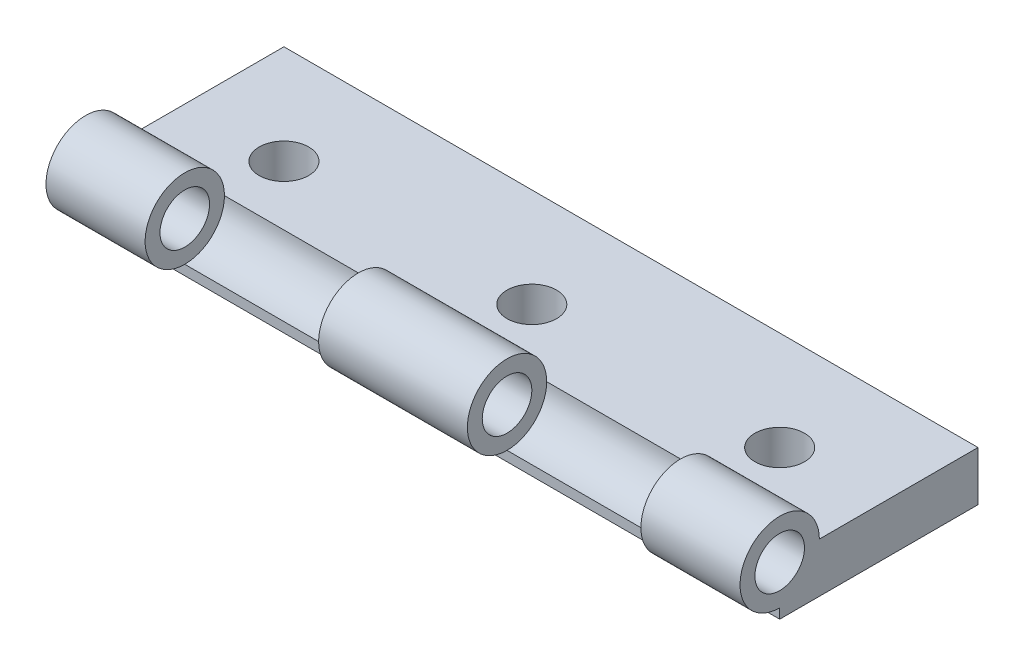
ISO-10303-21;
HEADER;
FILE_DESCRIPTION(('STEP AP214'),'2;1');
FILE_NAME('part.step','',(''),(''),'','','');
FILE_SCHEMA(('AUTOMOTIVE_DESIGN { 1 0 10303 214 1 1 1 1 }'));
ENDSEC;
DATA;
#1=APPLICATION_CONTEXT('core data for automotive mechanical design processes');
#2=APPLICATION_PROTOCOL_DEFINITION('international standard','automotive_design',2000,#1);
#3=PRODUCT_CONTEXT('',#1,'mechanical');
#4=PRODUCT('Part','Part','',(#3));
#5=PRODUCT_RELATED_PRODUCT_CATEGORY('part','',(#4));
#6=PRODUCT_DEFINITION_FORMATION('','',#4);
#7=PRODUCT_DEFINITION_CONTEXT('part definition',#1,'design');
#8=PRODUCT_DEFINITION('design','',#6,#7);
#9=PRODUCT_DEFINITION_SHAPE('','',#8);
#10=(LENGTH_UNIT() NAMED_UNIT(*) SI_UNIT(.MILLI.,.METRE.));
#11=(NAMED_UNIT(*) PLANE_ANGLE_UNIT() SI_UNIT($,.RADIAN.));
#12=(NAMED_UNIT(*) SI_UNIT($,.STERADIAN.) SOLID_ANGLE_UNIT());
#13=UNCERTAINTY_MEASURE_WITH_UNIT(LENGTH_MEASURE(1.E-05),#10,'distance_accuracy_value','');
#14=(GEOMETRIC_REPRESENTATION_CONTEXT(3) GLOBAL_UNCERTAINTY_ASSIGNED_CONTEXT((#13)) GLOBAL_UNIT_ASSIGNED_CONTEXT((#10,
#11,#12)) REPRESENTATION_CONTEXT('',''));
#15=CARTESIAN_POINT('',(0.,0.,0.));
#16=DIRECTION('',(0.,0.,1.));
#17=DIRECTION('',(1.,0.,0.));
#18=AXIS2_PLACEMENT_3D('',#15,#16,#17);
#19=CARTESIAN_POINT('',(44.45,6.35,0.));
#20=DIRECTION('',(-1.,0.,0.));
#21=DIRECTION('',(0.,0.,1.));
#22=AXIS2_PLACEMENT_3D('',#19,#20,#21);
#23=CYLINDRICAL_SURFACE('',#22,5.08);
#24=CARTESIAN_POINT('',(-9.525,6.35,0.));
#25=DIRECTION('',(1.,0.,0.));
#26=DIRECTION('',(0.,0.,-1.));
#27=AXIS2_PLACEMENT_3D('',#24,#25,#26);
#28=CIRCLE('',#27,5.08);
#29=CARTESIAN_POINT('',(-9.525,1.27,0.));
#30=VERTEX_POINT('',#29);
#31=CARTESIAN_POINT('',(-9.525,6.35,-5.08));
#32=VERTEX_POINT('',#31);
#33=EDGE_CURVE('E371',#30,#32,#28,.T.);
#34=ORIENTED_EDGE('',*,*,#33,.T.);
#35=DIRECTION('',(-1.,0.,0.));
#36=VECTOR('',#35,1.);
#37=CARTESIAN_POINT('',(44.45,6.35,-5.08));
#38=LINE('',#37,#36);
#39=CARTESIAN_POINT('',(-31.75,6.35,-5.08));
#40=VERTEX_POINT('',#39);
#41=EDGE_CURVE('E133',#40,#32,#38,.F.);
#42=ORIENTED_EDGE('',*,*,#41,.F.);
#43=CARTESIAN_POINT('',(-31.75,6.35,0.));
#44=DIRECTION('',(-1.,0.,0.));
#45=DIRECTION('',(0.,0.,1.));
#46=AXIS2_PLACEMENT_3D('',#43,#44,#45);
#47=CIRCLE('',#46,5.08);
#48=CARTESIAN_POINT('',(-31.75,1.27,0.));
#49=VERTEX_POINT('',#48);
#50=EDGE_CURVE('E134',#40,#49,#47,.T.);
#51=ORIENTED_EDGE('',*,*,#50,.T.);
#52=DIRECTION('',(-1.,0.,0.));
#53=VECTOR('',#52,1.);
#54=CARTESIAN_POINT('',(44.45,1.27,0.));
#55=LINE('',#54,#53);
#56=EDGE_CURVE('E48',#30,#49,#55,.T.);
#57=ORIENTED_EDGE('',*,*,#56,.F.);
#58=EDGE_LOOP('',(#34,#42,#51,#57));
#59=FACE_BOUND('',#58,.T.);
#60=ADVANCED_FACE('F39',(#59),#23,.F.);
#61=CARTESIAN_POINT('',(9.525,6.35,-5.08));
#62=VERTEX_POINT('',#61);
#63=CARTESIAN_POINT('',(31.75,6.35,-5.08));
#64=VERTEX_POINT('',#63);
#65=EDGE_CURVE('E128',#62,#64,#38,.F.);
#66=ORIENTED_EDGE('',*,*,#65,.F.);
#67=CARTESIAN_POINT('',(9.525,6.35,0.));
#68=DIRECTION('',(1.,0.,0.));
#69=DIRECTION('',(0.,0.,-1.));
#70=AXIS2_PLACEMENT_3D('',#67,#68,#69);
#71=CIRCLE('',#70,5.08);
#72=CARTESIAN_POINT('',(9.525,1.27,0.));
#73=VERTEX_POINT('',#72);
#74=EDGE_CURVE('E113',#73,#62,#71,.T.);
#75=ORIENTED_EDGE('',*,*,#74,.F.);
#76=CARTESIAN_POINT('',(31.75,1.27,0.));
#77=VERTEX_POINT('',#76);
#78=EDGE_CURVE('E47',#77,#73,#55,.T.);
#79=ORIENTED_EDGE('',*,*,#78,.F.);
#80=CARTESIAN_POINT('',(31.75,6.35,0.));
#81=DIRECTION('',(-1.,0.,0.));
#82=DIRECTION('',(0.,0.,1.));
#83=AXIS2_PLACEMENT_3D('',#80,#81,#82);
#84=CIRCLE('',#83,5.08);
#85=EDGE_CURVE('E63',#64,#77,#84,.T.);
#86=ORIENTED_EDGE('',*,*,#85,.F.);
#87=EDGE_LOOP('',(#66,#75,#79,#86));
#88=FACE_BOUND('',#87,.T.);
#89=ADVANCED_FACE('F129',(#88),#23,.F.);
#90=CARTESIAN_POINT('',(0.,6.35,0.));
#91=DIRECTION('',(0.,-1.,0.));
#92=DIRECTION('',(0.,0.,-1.));
#93=AXIS2_PLACEMENT_3D('',#90,#91,#92);
#94=PLANE('',#93);
#95=DIRECTION('',(0.,0.,1.));
#96=VECTOR('',#95,1.);
#97=CARTESIAN_POINT('',(-44.45,6.35,0.));
#98=LINE('',#97,#96);
#99=CARTESIAN_POINT('',(-44.45,6.35,-25.4));
#100=VERTEX_POINT('',#99);
#101=CARTESIAN_POINT('',(-44.45,6.35,-5.08));
#102=VERTEX_POINT('',#101);
#103=EDGE_CURVE('E192',#100,#102,#98,.T.);
#104=ORIENTED_EDGE('',*,*,#103,.T.);
#105=EDGE_CURVE('E136',#102,#40,#38,.F.);
#106=ORIENTED_EDGE('',*,*,#105,.T.);
#107=ORIENTED_EDGE('',*,*,#41,.T.);
#108=DIRECTION('',(-1.,0.,0.));
#109=VECTOR('',#108,1.);
#110=CARTESIAN_POINT('',(9.525,6.35,-5.08));
#111=LINE('',#110,#109);
#112=EDGE_CURVE('E125',#62,#32,#111,.T.);
#113=ORIENTED_EDGE('',*,*,#112,.F.);
#114=ORIENTED_EDGE('',*,*,#65,.T.);
#115=DIRECTION('',(1.,0.,0.));
#116=VECTOR('',#115,1.);
#117=CARTESIAN_POINT('',(31.75,6.35,-5.08));
#118=LINE('',#117,#116);
#119=CARTESIAN_POINT('',(44.45,6.35,-5.08));
#120=VERTEX_POINT('',#119);
#121=EDGE_CURVE('E152',#120,#64,#118,.F.);
#122=ORIENTED_EDGE('',*,*,#121,.F.);
#123=DIRECTION('',(0.,0.,-1.));
#124=VECTOR('',#123,1.);
#125=CARTESIAN_POINT('',(44.45,6.35,0.));
#126=LINE('',#125,#124);
#127=CARTESIAN_POINT('',(44.45,6.35,-25.4));
#128=VERTEX_POINT('',#127);
#129=EDGE_CURVE('E187',#120,#128,#126,.T.);
#130=ORIENTED_EDGE('',*,*,#129,.T.);
#131=DIRECTION('',(-1.,0.,0.));
#132=VECTOR('',#131,1.);
#133=CARTESIAN_POINT('',(-44.45,6.35,-25.4));
#134=LINE('',#133,#132);
#135=EDGE_CURVE('E189',#128,#100,#134,.T.);
#136=ORIENTED_EDGE('',*,*,#135,.T.);
#137=EDGE_LOOP('',(#104,#106,#107,#113,#114,#122,#130,#136));
#138=FACE_BOUND('',#137,.T.);
#139=CARTESIAN_POINT('',(-31.75,6.35,-12.7));
#140=DIRECTION('',(0.,1.,0.));
#141=DIRECTION('',(0.,0.,1.));
#142=AXIS2_PLACEMENT_3D('',#139,#140,#141);
#143=CIRCLE('',#142,3.175);
#144=CARTESIAN_POINT('',(-31.75,6.35,-9.52500000000001));
#145=VERTEX_POINT('',#144);
#146=EDGE_CURVE('E181',#145,#145,#143,.T.);
#147=ORIENTED_EDGE('',*,*,#146,.F.);
#148=EDGE_LOOP('',(#147));
#149=FACE_BOUND('',#148,.T.);
#150=CARTESIAN_POINT('',(0.,6.35,-12.7));
#151=DIRECTION('',(0.,1.,0.));
#152=DIRECTION('',(0.,0.,1.));
#153=AXIS2_PLACEMENT_3D('',#150,#151,#152);
#154=CIRCLE('',#153,3.175);
#155=CARTESIAN_POINT('',(0.,6.35,-9.525));
#156=VERTEX_POINT('',#155);
#157=EDGE_CURVE('E175',#156,#156,#154,.T.);
#158=ORIENTED_EDGE('',*,*,#157,.F.);
#159=EDGE_LOOP('',(#158));
#160=FACE_BOUND('',#159,.T.);
#161=CARTESIAN_POINT('',(31.75,6.35,-12.7));
#162=DIRECTION('',(0.,1.,0.));
#163=DIRECTION('',(0.,0.,1.));
#164=AXIS2_PLACEMENT_3D('',#161,#162,#163);
#165=CIRCLE('',#164,3.175);
#166=CARTESIAN_POINT('',(31.75,6.35,-9.52500000000001));
#167=VERTEX_POINT('',#166);
#168=EDGE_CURVE('E169',#167,#167,#165,.T.);
#169=ORIENTED_EDGE('',*,*,#168,.F.);
#170=EDGE_LOOP('',(#169));
#171=FACE_BOUND('',#170,.T.);
#172=ADVANCED_FACE('F138',(#138,#149,#160,#171),#94,.F.);
#173=CARTESIAN_POINT('',(0.,0.,0.));
#174=DIRECTION('',(0.,-1.,0.));
#175=DIRECTION('',(0.,0.,-1.));
#176=AXIS2_PLACEMENT_3D('',#173,#174,#175);
#177=PLANE('',#176);
#178=CARTESIAN_POINT('',(0.,0.,-12.7));
#179=DIRECTION('',(0.,1.,0.));
#180=DIRECTION('',(0.,0.,1.));
#181=AXIS2_PLACEMENT_3D('',#178,#179,#180);
#182=CIRCLE('',#181,3.175);
#183=CARTESIAN_POINT('',(0.,0.,-9.525));
#184=VERTEX_POINT('',#183);
#185=EDGE_CURVE('E172',#184,#184,#182,.T.);
#186=ORIENTED_EDGE('',*,*,#185,.T.);
#187=EDGE_LOOP('',(#186));
#188=FACE_BOUND('',#187,.T.);
#189=DIRECTION('',(0.,0.,-1.));
#190=VECTOR('',#189,1.);
#191=CARTESIAN_POINT('',(44.45,0.,0.));
#192=LINE('',#191,#190);
#193=CARTESIAN_POINT('',(44.45,0.,0.));
#194=VERTEX_POINT('',#193);
#195=CARTESIAN_POINT('',(44.45,0.,-25.4));
#196=VERTEX_POINT('',#195);
#197=EDGE_CURVE('E184',#194,#196,#192,.T.);
#198=ORIENTED_EDGE('',*,*,#197,.F.);
#199=DIRECTION('',(1.,0.,0.));
#200=VECTOR('',#199,1.);
#201=CARTESIAN_POINT('',(-44.45,0.,0.));
#202=LINE('',#201,#200);
#203=CARTESIAN_POINT('',(-44.45,0.,0.));
#204=VERTEX_POINT('',#203);
#205=EDGE_CURVE('E190',#204,#194,#202,.T.);
#206=ORIENTED_EDGE('',*,*,#205,.F.);
#207=DIRECTION('',(0.,0.,1.));
#208=VECTOR('',#207,1.);
#209=CARTESIAN_POINT('',(-44.45,0.,0.));
#210=LINE('',#209,#208);
#211=CARTESIAN_POINT('',(-44.45,0.,-25.4));
#212=VERTEX_POINT('',#211);
#213=EDGE_CURVE('E199',#212,#204,#210,.T.);
#214=ORIENTED_EDGE('',*,*,#213,.F.);
#215=DIRECTION('',(-1.,0.,0.));
#216=VECTOR('',#215,1.);
#217=CARTESIAN_POINT('',(-44.45,0.,-25.4));
#218=LINE('',#217,#216);
#219=EDGE_CURVE('E197',#196,#212,#218,.T.);
#220=ORIENTED_EDGE('',*,*,#219,.F.);
#221=EDGE_LOOP('',(#198,#206,#214,#220));
#222=FACE_BOUND('',#221,.T.);
#223=CARTESIAN_POINT('',(-31.75,0.,-12.7));
#224=DIRECTION('',(0.,1.,0.));
#225=DIRECTION('',(0.,0.,1.));
#226=AXIS2_PLACEMENT_3D('',#223,#224,#225);
#227=CIRCLE('',#226,3.175);
#228=CARTESIAN_POINT('',(-31.75,0.,-9.52500000000001));
#229=VERTEX_POINT('',#228);
#230=EDGE_CURVE('E178',#229,#229,#227,.T.);
#231=ORIENTED_EDGE('',*,*,#230,.T.);
#232=EDGE_LOOP('',(#231));
#233=FACE_BOUND('',#232,.T.);
#234=CARTESIAN_POINT('',(31.75,0.,-12.7));
#235=DIRECTION('',(0.,1.,0.));
#236=DIRECTION('',(0.,0.,1.));
#237=AXIS2_PLACEMENT_3D('',#234,#235,#236);
#238=CIRCLE('',#237,3.175);
#239=CARTESIAN_POINT('',(31.75,0.,-9.52500000000001));
#240=VERTEX_POINT('',#239);
#241=EDGE_CURVE('E168',#240,#240,#238,.T.);
#242=ORIENTED_EDGE('',*,*,#241,.T.);
#243=EDGE_LOOP('',(#242));
#244=FACE_BOUND('',#243,.T.);
#245=ADVANCED_FACE('F264',(#188,#222,#233,#244),#177,.T.);
#246=CARTESIAN_POINT('',(44.45,6.35,0.));
#247=DIRECTION('',(-1.,0.,0.));
#248=DIRECTION('',(0.,0.,1.));
#249=AXIS2_PLACEMENT_3D('',#246,#247,#248);
#250=PLANE('',#249);
#251=ORIENTED_EDGE('',*,*,#129,.F.);
#252=CARTESIAN_POINT('',(44.45,6.35,0.));
#253=DIRECTION('',(-1.,0.,0.));
#254=DIRECTION('',(0.,0.,1.));
#255=AXIS2_PLACEMENT_3D('',#252,#253,#254);
#256=CIRCLE('',#255,5.08);
#257=CARTESIAN_POINT('',(44.45,1.27,0.));
#258=VERTEX_POINT('',#257);
#259=EDGE_CURVE('E149',#258,#120,#256,.T.);
#260=ORIENTED_EDGE('',*,*,#259,.F.);
#261=DIRECTION('',(0.,-1.,0.));
#262=VECTOR('',#261,1.);
#263=CARTESIAN_POINT('',(44.45,6.35,0.));
#264=LINE('',#263,#262);
#265=EDGE_CURVE('E194',#258,#194,#264,.T.);
#266=ORIENTED_EDGE('',*,*,#265,.T.);
#267=ORIENTED_EDGE('',*,*,#197,.T.);
#268=DIRECTION('',(0.,-1.,0.));
#269=VECTOR('',#268,1.);
#270=CARTESIAN_POINT('',(44.45,6.35,-25.4));
#271=LINE('',#270,#269);
#272=EDGE_CURVE('E209',#128,#196,#271,.T.);
#273=ORIENTED_EDGE('',*,*,#272,.F.);
#274=EDGE_LOOP('',(#251,#260,#266,#267,#273));
#275=FACE_BOUND('',#274,.T.);
#276=CARTESIAN_POINT('',(44.45,6.35,0.));
#277=DIRECTION('',(-1.,0.,0.));
#278=DIRECTION('',(0.,0.,1.));
#279=AXIS2_PLACEMENT_3D('',#276,#277,#278);
#280=CIRCLE('',#279,3.175);
#281=CARTESIAN_POINT('',(44.45,6.35,3.175));
#282=VERTEX_POINT('',#281);
#283=EDGE_CURVE('E141',#282,#282,#280,.T.);
#284=ORIENTED_EDGE('',*,*,#283,.T.);
#285=EDGE_LOOP('',(#284));
#286=FACE_BOUND('',#285,.T.);
#287=ADVANCED_FACE('F41',(#275,#286),#250,.F.);
#288=CARTESIAN_POINT('',(-44.45,6.35,-25.4));
#289=DIRECTION('',(0.,0.,1.));
#290=DIRECTION('',(1.,0.,0.));
#291=AXIS2_PLACEMENT_3D('',#288,#289,#290);
#292=PLANE('',#291);
#293=ORIENTED_EDGE('',*,*,#219,.T.);
#294=DIRECTION('',(0.,-1.,0.));
#295=VECTOR('',#294,1.);
#296=CARTESIAN_POINT('',(-44.45,6.35,-25.4));
#297=LINE('',#296,#295);
#298=EDGE_CURVE('E207',#100,#212,#297,.T.);
#299=ORIENTED_EDGE('',*,*,#298,.F.);
#300=ORIENTED_EDGE('',*,*,#135,.F.);
#301=ORIENTED_EDGE('',*,*,#272,.T.);
#302=EDGE_LOOP('',(#293,#299,#300,#301));
#303=FACE_BOUND('',#302,.T.);
#304=ADVANCED_FACE('F272',(#303),#292,.F.);
#305=CARTESIAN_POINT('',(-44.45,6.35,0.));
#306=DIRECTION('',(1.,0.,0.));
#307=DIRECTION('',(0.,0.,-1.));
#308=AXIS2_PLACEMENT_3D('',#305,#306,#307);
#309=PLANE('',#308);
#310=DIRECTION('',(0.,-1.,0.));
#311=VECTOR('',#310,1.);
#312=CARTESIAN_POINT('',(-44.45,6.35,0.));
#313=LINE('',#312,#311);
#314=CARTESIAN_POINT('',(-44.45,1.27,0.));
#315=VERTEX_POINT('',#314);
#316=EDGE_CURVE('E205',#315,#204,#313,.T.);
#317=ORIENTED_EDGE('',*,*,#316,.F.);
#318=CARTESIAN_POINT('',(-44.45,6.35,0.));
#319=DIRECTION('',(-1.,0.,0.));
#320=DIRECTION('',(0.,0.,1.));
#321=AXIS2_PLACEMENT_3D('',#318,#319,#320);
#322=CIRCLE('',#321,5.08);
#323=EDGE_CURVE('E160',#315,#102,#322,.T.);
#324=ORIENTED_EDGE('',*,*,#323,.T.);
#325=ORIENTED_EDGE('',*,*,#103,.F.);
#326=ORIENTED_EDGE('',*,*,#298,.T.);
#327=ORIENTED_EDGE('',*,*,#213,.T.);
#328=EDGE_LOOP('',(#317,#324,#325,#326,#327));
#329=FACE_BOUND('',#328,.T.);
#330=CARTESIAN_POINT('',(-44.45,6.35,0.));
#331=DIRECTION('',(-1.,0.,0.));
#332=DIRECTION('',(0.,0.,1.));
#333=AXIS2_PLACEMENT_3D('',#330,#331,#332);
#334=CIRCLE('',#333,3.175);
#335=CARTESIAN_POINT('',(-44.45,6.35,3.175));
#336=VERTEX_POINT('',#335);
#337=EDGE_CURVE('E156',#336,#336,#334,.T.);
#338=ORIENTED_EDGE('',*,*,#337,.F.);
#339=EDGE_LOOP('',(#338));
#340=FACE_BOUND('',#339,.T.);
#341=ADVANCED_FACE('F270',(#329,#340),#309,.F.);
#342=CARTESIAN_POINT('',(-44.45,6.35,0.));
#343=DIRECTION('',(0.,0.,-1.));
#344=DIRECTION('',(-1.,0.,0.));
#345=AXIS2_PLACEMENT_3D('',#342,#343,#344);
#346=PLANE('',#345);
#347=ORIENTED_EDGE('',*,*,#265,.F.);
#348=EDGE_CURVE('E11',#258,#77,#55,.T.);
#349=ORIENTED_EDGE('',*,*,#348,.T.);
#350=ORIENTED_EDGE('',*,*,#78,.T.);
#351=EDGE_CURVE('E127',#73,#30,#55,.T.);
#352=ORIENTED_EDGE('',*,*,#351,.T.);
#353=ORIENTED_EDGE('',*,*,#56,.T.);
#354=EDGE_CURVE('E49',#49,#315,#55,.T.);
#355=ORIENTED_EDGE('',*,*,#354,.T.);
#356=ORIENTED_EDGE('',*,*,#316,.T.);
#357=ORIENTED_EDGE('',*,*,#205,.T.);
#358=EDGE_LOOP('',(#347,#349,#350,#352,#353,#355,#356,#357));
#359=FACE_BOUND('',#358,.T.);
#360=ADVANCED_FACE('F219',(#359),#346,.F.);
#361=CARTESIAN_POINT('',(-31.75,6.35,-12.7));
#362=DIRECTION('',(0.,-1.,0.));
#363=DIRECTION('',(0.,0.,-1.));
#364=AXIS2_PLACEMENT_3D('',#361,#362,#363);
#365=CYLINDRICAL_SURFACE('',#364,3.175);
#366=ORIENTED_EDGE('',*,*,#146,.T.);
#367=EDGE_LOOP('',(#366));
#368=FACE_BOUND('',#367,.T.);
#369=ORIENTED_EDGE('',*,*,#230,.F.);
#370=EDGE_LOOP('',(#369));
#371=FACE_BOUND('',#370,.T.);
#372=ADVANCED_FACE('F257',(#368,#371),#365,.F.);
#373=CARTESIAN_POINT('',(0.,6.35,-12.7));
#374=DIRECTION('',(0.,-1.,0.));
#375=DIRECTION('',(0.,0.,-1.));
#376=AXIS2_PLACEMENT_3D('',#373,#374,#375);
#377=CYLINDRICAL_SURFACE('',#376,3.175);
#378=ORIENTED_EDGE('',*,*,#157,.T.);
#379=EDGE_LOOP('',(#378));
#380=FACE_BOUND('',#379,.T.);
#381=ORIENTED_EDGE('',*,*,#185,.F.);
#382=EDGE_LOOP('',(#381));
#383=FACE_BOUND('',#382,.T.);
#384=ADVANCED_FACE('F253',(#380,#383),#377,.F.);
#385=CARTESIAN_POINT('',(31.75,6.35,-12.7));
#386=DIRECTION('',(0.,-1.,0.));
#387=DIRECTION('',(0.,0.,-1.));
#388=AXIS2_PLACEMENT_3D('',#385,#386,#387);
#389=CYLINDRICAL_SURFACE('',#388,3.175);
#390=ORIENTED_EDGE('',*,*,#168,.T.);
#391=EDGE_LOOP('',(#390));
#392=FACE_BOUND('',#391,.T.);
#393=ORIENTED_EDGE('',*,*,#241,.F.);
#394=EDGE_LOOP('',(#393));
#395=FACE_BOUND('',#394,.T.);
#396=ADVANCED_FACE('F242',(#392,#395),#389,.F.);
#397=CARTESIAN_POINT('',(-31.75,6.35,0.));
#398=DIRECTION('',(-1.,0.,0.));
#399=DIRECTION('',(0.,0.,1.));
#400=AXIS2_PLACEMENT_3D('',#397,#398,#399);
#401=CYLINDRICAL_SURFACE('',#400,5.08);
#402=ORIENTED_EDGE('',*,*,#105,.F.);
#403=ORIENTED_EDGE('',*,*,#323,.F.);
#404=ORIENTED_EDGE('',*,*,#354,.F.);
#405=EDGE_CURVE('E165',#49,#40,#47,.T.);
#406=ORIENTED_EDGE('',*,*,#405,.T.);
#407=EDGE_LOOP('',(#402,#403,#404,#406));
#408=FACE_BOUND('',#407,.T.);
#409=ADVANCED_FACE('F229',(#408),#401,.T.);
#410=CARTESIAN_POINT('',(-31.75,6.35,0.));
#411=DIRECTION('',(-1.,0.,0.));
#412=DIRECTION('',(0.,0.,1.));
#413=AXIS2_PLACEMENT_3D('',#410,#411,#412);
#414=PLANE('',#413);
#415=CARTESIAN_POINT('',(-31.75,6.35,0.));
#416=DIRECTION('',(-1.,0.,0.));
#417=DIRECTION('',(0.,0.,1.));
#418=AXIS2_PLACEMENT_3D('',#415,#416,#417);
#419=CIRCLE('',#418,3.175);
#420=CARTESIAN_POINT('',(-31.75,6.35,3.175));
#421=VERTEX_POINT('',#420);
#422=EDGE_CURVE('E157',#421,#421,#419,.T.);
#423=ORIENTED_EDGE('',*,*,#422,.T.);
#424=EDGE_LOOP('',(#423));
#425=FACE_BOUND('',#424,.T.);
#426=ORIENTED_EDGE('',*,*,#50,.F.);
#427=ORIENTED_EDGE('',*,*,#405,.F.);
#428=EDGE_LOOP('',(#426,#427));
#429=FACE_BOUND('',#428,.T.);
#430=ADVANCED_FACE('F230',(#425,#429),#414,.F.);
#431=CARTESIAN_POINT('',(-31.75,6.35,0.));
#432=DIRECTION('',(-1.,0.,0.));
#433=DIRECTION('',(0.,0.,1.));
#434=AXIS2_PLACEMENT_3D('',#431,#432,#433);
#435=CYLINDRICAL_SURFACE('',#434,3.175);
#436=ORIENTED_EDGE('',*,*,#422,.F.);
#437=EDGE_LOOP('',(#436));
#438=FACE_BOUND('',#437,.T.);
#439=ORIENTED_EDGE('',*,*,#337,.T.);
#440=EDGE_LOOP('',(#439));
#441=FACE_BOUND('',#440,.T.);
#442=ADVANCED_FACE('F232',(#438,#441),#435,.F.);
#443=CARTESIAN_POINT('',(31.75,6.35,0.));
#444=DIRECTION('',(1.,0.,0.));
#445=DIRECTION('',(0.,0.,-1.));
#446=AXIS2_PLACEMENT_3D('',#443,#444,#445);
#447=CYLINDRICAL_SURFACE('',#446,5.08);
#448=ORIENTED_EDGE('',*,*,#259,.T.);
#449=ORIENTED_EDGE('',*,*,#121,.T.);
#450=EDGE_CURVE('E153',#77,#64,#84,.T.);
#451=ORIENTED_EDGE('',*,*,#450,.F.);
#452=ORIENTED_EDGE('',*,*,#348,.F.);
#453=EDGE_LOOP('',(#448,#449,#451,#452));
#454=FACE_BOUND('',#453,.T.);
#455=ADVANCED_FACE('F239',(#454),#447,.T.);
#456=CARTESIAN_POINT('',(31.75,6.35,0.));
#457=DIRECTION('',(1.,0.,0.));
#458=DIRECTION('',(0.,0.,1.));
#459=AXIS2_PLACEMENT_3D('',#456,#457,#458);
#460=PLANE('',#459);
#461=ORIENTED_EDGE('',*,*,#85,.T.);
#462=ORIENTED_EDGE('',*,*,#450,.T.);
#463=EDGE_LOOP('',(#461,#462));
#464=FACE_BOUND('',#463,.T.);
#465=CARTESIAN_POINT('',(31.75,6.35,0.));
#466=DIRECTION('',(-1.,0.,0.));
#467=DIRECTION('',(0.,0.,1.));
#468=AXIS2_PLACEMENT_3D('',#465,#466,#467);
#469=CIRCLE('',#468,3.175);
#470=CARTESIAN_POINT('',(31.75,6.35,3.175));
#471=VERTEX_POINT('',#470);
#472=EDGE_CURVE('E144',#471,#471,#469,.T.);
#473=ORIENTED_EDGE('',*,*,#472,.F.);
#474=EDGE_LOOP('',(#473));
#475=FACE_BOUND('',#474,.T.);
#476=ADVANCED_FACE('F291',(#464,#475),#460,.F.);
#477=CARTESIAN_POINT('',(31.75,6.35,0.));
#478=DIRECTION('',(1.,0.,0.));
#479=DIRECTION('',(0.,0.,-1.));
#480=AXIS2_PLACEMENT_3D('',#477,#478,#479);
#481=CYLINDRICAL_SURFACE('',#480,3.175);
#482=ORIENTED_EDGE('',*,*,#472,.T.);
#483=EDGE_LOOP('',(#482));
#484=FACE_BOUND('',#483,.T.);
#485=ORIENTED_EDGE('',*,*,#283,.F.);
#486=EDGE_LOOP('',(#485));
#487=FACE_BOUND('',#486,.T.);
#488=ADVANCED_FACE('F294',(#484,#487),#481,.F.);
#489=CARTESIAN_POINT('',(9.525,6.35,0.));
#490=DIRECTION('',(-1.,0.,0.));
#491=DIRECTION('',(0.,0.,1.));
#492=AXIS2_PLACEMENT_3D('',#489,#490,#491);
#493=CYLINDRICAL_SURFACE('',#492,5.08);
#494=EDGE_CURVE('E117',#62,#73,#71,.T.);
#495=ORIENTED_EDGE('',*,*,#494,.F.);
#496=ORIENTED_EDGE('',*,*,#112,.T.);
#497=EDGE_CURVE('E56',#32,#30,#28,.T.);
#498=ORIENTED_EDGE('',*,*,#497,.T.);
#499=ORIENTED_EDGE('',*,*,#351,.F.);
#500=EDGE_LOOP('',(#495,#496,#498,#499));
#501=FACE_BOUND('',#500,.T.);
#502=ADVANCED_FACE('F123',(#501),#493,.T.);
#503=CARTESIAN_POINT('',(9.525,6.35,0.));
#504=DIRECTION('',(1.,0.,0.));
#505=DIRECTION('',(0.,0.,-1.));
#506=AXIS2_PLACEMENT_3D('',#503,#504,#505);
#507=PLANE('',#506);
#508=ORIENTED_EDGE('',*,*,#494,.T.);
#509=ORIENTED_EDGE('',*,*,#74,.T.);
#510=EDGE_LOOP('',(#508,#509));
#511=FACE_BOUND('',#510,.T.);
#512=CARTESIAN_POINT('',(9.525,6.35,0.));
#513=DIRECTION('',(1.,0.,0.));
#514=DIRECTION('',(0.,0.,-1.));
#515=AXIS2_PLACEMENT_3D('',#512,#513,#514);
#516=CIRCLE('',#515,3.175);
#517=CARTESIAN_POINT('',(9.525,6.35,3.175));
#518=VERTEX_POINT('',#517);
#519=EDGE_CURVE('E365',#518,#518,#516,.T.);
#520=ORIENTED_EDGE('',*,*,#519,.F.);
#521=EDGE_LOOP('',(#520));
#522=FACE_BOUND('',#521,.T.);
#523=ADVANCED_FACE('F115',(#511,#522),#507,.T.);
#524=CARTESIAN_POINT('',(-9.525,6.35,0.));
#525=DIRECTION('',(1.,0.,0.));
#526=DIRECTION('',(0.,0.,-1.));
#527=AXIS2_PLACEMENT_3D('',#524,#525,#526);
#528=PLANE('',#527);
#529=ORIENTED_EDGE('',*,*,#497,.F.);
#530=ORIENTED_EDGE('',*,*,#33,.F.);
#531=EDGE_LOOP('',(#529,#530));
#532=FACE_BOUND('',#531,.T.);
#533=CARTESIAN_POINT('',(-9.525,6.35,0.));
#534=DIRECTION('',(1.,0.,0.));
#535=DIRECTION('',(0.,0.,-1.));
#536=AXIS2_PLACEMENT_3D('',#533,#534,#535);
#537=CIRCLE('',#536,3.175);
#538=CARTESIAN_POINT('',(-9.525,6.35,3.175));
#539=VERTEX_POINT('',#538);
#540=EDGE_CURVE('E368',#539,#539,#537,.T.);
#541=ORIENTED_EDGE('',*,*,#540,.T.);
#542=EDGE_LOOP('',(#541));
#543=FACE_BOUND('',#542,.T.);
#544=ADVANCED_FACE('F341',(#532,#543),#528,.F.);
#545=CARTESIAN_POINT('',(9.525,6.35,0.));
#546=DIRECTION('',(-1.,0.,0.));
#547=DIRECTION('',(0.,0.,1.));
#548=AXIS2_PLACEMENT_3D('',#545,#546,#547);
#549=CYLINDRICAL_SURFACE('',#548,3.175);
#550=CARTESIAN_POINT('',(9.525,6.35,3.175));
#551=CARTESIAN_POINT('',(9.3265625,6.35,3.175));
#552=CARTESIAN_POINT('',(9.128125,6.35,3.175));
#553=CARTESIAN_POINT('',(8.73125,6.35,3.175));
#554=CARTESIAN_POINT('',(8.5328125,6.35,3.175));
#555=CARTESIAN_POINT('',(8.1359375,6.35,3.175));
#556=CARTESIAN_POINT('',(7.9375,6.35,3.175));
#557=CARTESIAN_POINT('',(7.540625,6.35,3.175));
#558=CARTESIAN_POINT('',(7.3421875,6.35,3.175));
#559=CARTESIAN_POINT('',(6.9453125,6.35,3.175));
#560=CARTESIAN_POINT('',(6.746875,6.35,3.175));
#561=CARTESIAN_POINT('',(6.35,6.35,3.175));
#562=CARTESIAN_POINT('',(6.1515625,6.35,3.175));
#563=CARTESIAN_POINT('',(5.7546875,6.35,3.175));
#564=CARTESIAN_POINT('',(5.55625,6.35,3.175));
#565=CARTESIAN_POINT('',(5.159375,6.35,3.175));
#566=CARTESIAN_POINT('',(4.9609375,6.35,3.175));
#567=CARTESIAN_POINT('',(4.5640625,6.35,3.175));
#568=CARTESIAN_POINT('',(4.365625,6.35,3.175));
#569=CARTESIAN_POINT('',(3.96875,6.35,3.175));
#570=CARTESIAN_POINT('',(3.7703125,6.35,3.175));
#571=CARTESIAN_POINT('',(3.3734375,6.35,3.175));
#572=CARTESIAN_POINT('',(3.175,6.35,3.175));
#573=CARTESIAN_POINT('',(2.778125,6.35,3.175));
#574=CARTESIAN_POINT('',(2.5796875,6.35,3.175));
#575=CARTESIAN_POINT('',(2.1828125,6.35,3.175));
#576=CARTESIAN_POINT('',(1.984375,6.35,3.175));
#577=CARTESIAN_POINT('',(1.5875,6.35,3.175));
#578=CARTESIAN_POINT('',(1.3890625,6.35,3.175));
#579=CARTESIAN_POINT('',(0.992187499999999,6.35,3.175));
#580=CARTESIAN_POINT('',(0.793749999999999,6.35,3.175));
#581=CARTESIAN_POINT('',(0.396874999999998,6.35,3.175));
#582=CARTESIAN_POINT('',(0.198437499999998,6.35,3.175));
#583=CARTESIAN_POINT('',(-0.198437500000002,6.35,3.175));
#584=CARTESIAN_POINT('',(-0.396875000000002,6.35,3.175));
#585=CARTESIAN_POINT('',(-0.793750000000002,6.35,3.175));
#586=CARTESIAN_POINT('',(-0.992187500000002,6.35,3.175));
#587=CARTESIAN_POINT('',(-1.3890625,6.35,3.175));
#588=CARTESIAN_POINT('',(-1.5875,6.35,3.175));
#589=CARTESIAN_POINT('',(-1.984375,6.35,3.175));
#590=CARTESIAN_POINT('',(-2.1828125,6.35,3.175));
#591=CARTESIAN_POINT('',(-2.5796875,6.35,3.175));
#592=CARTESIAN_POINT('',(-2.778125,6.35,3.175));
#593=CARTESIAN_POINT('',(-3.175,6.35,3.175));
#594=CARTESIAN_POINT('',(-3.3734375,6.35,3.175));
#595=CARTESIAN_POINT('',(-3.7703125,6.35,3.175));
#596=CARTESIAN_POINT('',(-3.96875,6.35,3.175));
#597=CARTESIAN_POINT('',(-4.365625,6.35,3.175));
#598=CARTESIAN_POINT('',(-4.5640625,6.35,3.175));
#599=CARTESIAN_POINT('',(-4.9609375,6.35,3.175));
#600=CARTESIAN_POINT('',(-5.159375,6.35,3.175));
#601=CARTESIAN_POINT('',(-5.55625,6.35,3.175));
#602=CARTESIAN_POINT('',(-5.7546875,6.35,3.175));
#603=CARTESIAN_POINT('',(-6.1515625,6.35,3.175));
#604=CARTESIAN_POINT('',(-6.35,6.35,3.175));
#605=CARTESIAN_POINT('',(-6.746875,6.35,3.175));
#606=CARTESIAN_POINT('',(-6.9453125,6.35,3.175));
#607=CARTESIAN_POINT('',(-7.3421875,6.35,3.175));
#608=CARTESIAN_POINT('',(-7.540625,6.35,3.175));
#609=CARTESIAN_POINT('',(-7.9375,6.35,3.175));
#610=CARTESIAN_POINT('',(-8.1359375,6.35,3.175));
#611=CARTESIAN_POINT('',(-8.5328125,6.35,3.175));
#612=CARTESIAN_POINT('',(-8.73125,6.35,3.175));
#613=CARTESIAN_POINT('',(-9.128125,6.35,3.175));
#614=CARTESIAN_POINT('',(-9.3265625,6.35,3.175));
#615=CARTESIAN_POINT('',(-9.525,6.35,3.175));
#616=B_SPLINE_CURVE_WITH_KNOTS('',3,(#550,#551,#552,#553,#554,#555,#556,#557,#558,#559,#560,
#561,#562,#563,#564,#565,#566,#567,#568,#569,#570,#571,#572,#573,#574,#575,#576,#577,#578,#579,
#580,#581,#582,#583,#584,#585,#586,#587,#588,#589,#590,#591,#592,#593,#594,#595,#596,#597,#598,
#599,#600,#601,#602,#603,#604,#605,#606,#607,#608,#609,#610,#611,#612,#613,#614,#615),
.UNSPECIFIED.,.F.,.F.,(4,2,2,2,2,2,2,2,2,2,2,2,2,2,2,2,2,2,2,2,2,2,2,2,2,2,2,2,2,2,2,2,4),(0.,
0.595312499999999,1.190625,1.7859375,2.38125,2.9765625,3.571875,4.1671875,4.7625,5.3578125,
5.953125,6.5484375,7.14375,7.7390625,8.334375,8.9296875,9.525,10.1203125,10.715625,11.3109375,
11.90625,12.5015625,13.096875,13.6921875,14.2875,14.8828125,15.478125,16.0734375,16.66875,
17.2640625,17.859375,18.4546875,19.05),.UNSPECIFIED.);
#617=EDGE_CURVE('BSEAM350',#518,#539,#616,.T.);
#618=ORIENTED_EDGE('',*,*,#519,.T.);
#619=ORIENTED_EDGE('',*,*,#540,.F.);
#620=ORIENTED_EDGE('',*,*,#617,.T.);
#621=ORIENTED_EDGE('',*,*,#617,.F.);
#622=EDGE_LOOP('',(#618,#620,#619,#621));
#623=FACE_BOUND('',#622,.T.);
#624=ADVANCED_FACE('F350',(#623),#549,.F.);
#625=CLOSED_SHELL('',(#60,#89,#172,#245,#287,#304,#341,#360,#372,#384,#396,#409,#430,#442,#455,
#476,#488,#502,#523,#544,#624));
#626=MANIFOLD_SOLID_BREP('B2',#625);
#627=ADVANCED_BREP_SHAPE_REPRESENTATION('',(#18,#626),#14);
#628=SHAPE_DEFINITION_REPRESENTATION(#9,#627);
ENDSEC;
END-ISO-10303-21;
